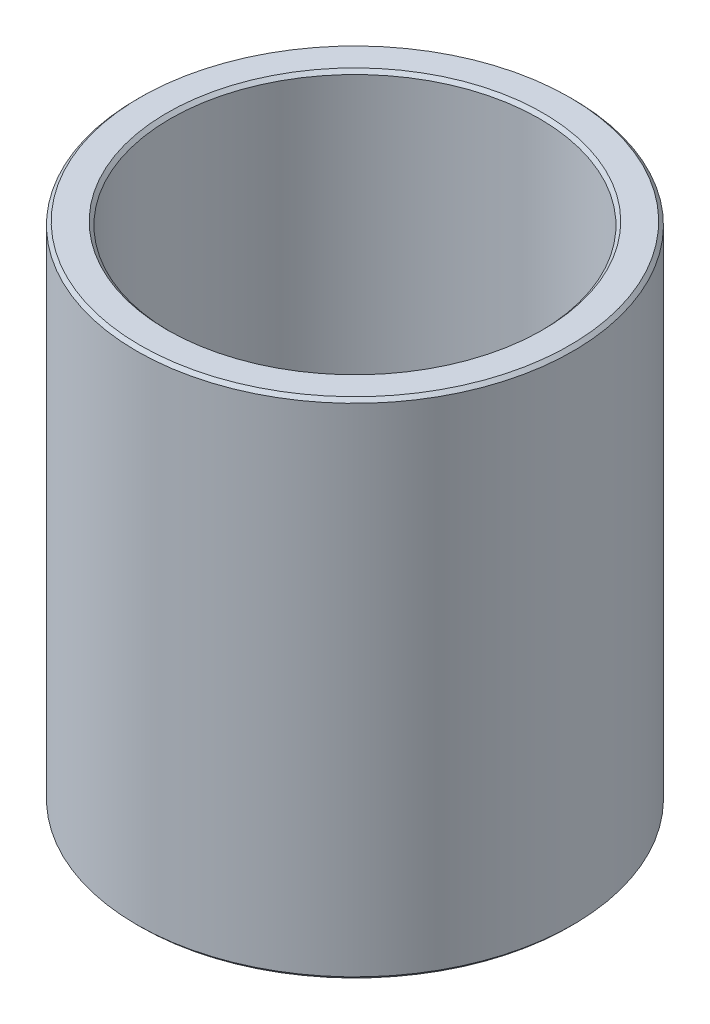
ISO-10303-21;
HEADER;
FILE_DESCRIPTION(('STEP AP214'),'2;1');
FILE_NAME('part.step','',(''),(''),'','','');
FILE_SCHEMA(('AUTOMOTIVE_DESIGN { 1 0 10303 214 1 1 1 1 }'));
ENDSEC;
DATA;
#1=APPLICATION_CONTEXT('core data for automotive mechanical design processes');
#2=APPLICATION_PROTOCOL_DEFINITION('international standard','automotive_design',2000,#1);
#3=PRODUCT_CONTEXT('',#1,'mechanical');
#4=PRODUCT('Part','Part','',(#3));
#5=PRODUCT_RELATED_PRODUCT_CATEGORY('part','',(#4));
#6=PRODUCT_DEFINITION_FORMATION('','',#4);
#7=PRODUCT_DEFINITION_CONTEXT('part definition',#1,'design');
#8=PRODUCT_DEFINITION('design','',#6,#7);
#9=PRODUCT_DEFINITION_SHAPE('','',#8);
#10=(LENGTH_UNIT() NAMED_UNIT(*) SI_UNIT(.MILLI.,.METRE.));
#11=(NAMED_UNIT(*) PLANE_ANGLE_UNIT() SI_UNIT($,.RADIAN.));
#12=(NAMED_UNIT(*) SI_UNIT($,.STERADIAN.) SOLID_ANGLE_UNIT());
#13=UNCERTAINTY_MEASURE_WITH_UNIT(LENGTH_MEASURE(1.E-05),#10,'distance_accuracy_value','');
#14=(GEOMETRIC_REPRESENTATION_CONTEXT(3) GLOBAL_UNCERTAINTY_ASSIGNED_CONTEXT((#13)) GLOBAL_UNIT_ASSIGNED_CONTEXT((#10,
#11,#12)) REPRESENTATION_CONTEXT('',''));
#15=CARTESIAN_POINT('',(0.,0.,0.));
#16=DIRECTION('',(0.,0.,1.));
#17=DIRECTION('',(1.,0.,0.));
#18=AXIS2_PLACEMENT_3D('',#15,#16,#17);
#19=CARTESIAN_POINT('',(0.,30.,0.));
#20=DIRECTION('',(0.,1.,0.));
#21=DIRECTION('',(0.,0.,1.));
#22=AXIS2_PLACEMENT_3D('',#19,#20,#21);
#23=PLANE('',#22);
#24=CARTESIAN_POINT('',(0.,30.,0.));
#25=DIRECTION('',(0.,1.,0.));
#26=DIRECTION('',(0.,0.,1.));
#27=AXIS2_PLACEMENT_3D('',#24,#25,#26);
#28=CIRCLE('',#27,11.2);
#29=CARTESIAN_POINT('',(0.,30.,11.2));
#30=VERTEX_POINT('',#29);
#31=EDGE_CURVE('E10',#30,#30,#28,.F.);
#32=ORIENTED_EDGE('',*,*,#31,.T.);
#33=EDGE_LOOP('',(#32));
#34=FACE_BOUND('',#33,.T.);
#35=CARTESIAN_POINT('',(0.,30.,0.));
#36=DIRECTION('',(0.,1.,0.));
#37=DIRECTION('',(0.,0.,1.));
#38=AXIS2_PLACEMENT_3D('',#35,#36,#37);
#39=CIRCLE('',#38,12.8);
#40=CARTESIAN_POINT('',(0.,30.,12.8));
#41=VERTEX_POINT('',#40);
#42=EDGE_CURVE('E37',#41,#41,#39,.T.);
#43=ORIENTED_EDGE('',*,*,#42,.T.);
#44=EDGE_LOOP('',(#43));
#45=FACE_BOUND('',#44,.T.);
#46=ADVANCED_FACE('F30',(#34,#45),#23,.T.);
#47=CARTESIAN_POINT('',(0.,0.,0.));
#48=DIRECTION('',(0.,1.,0.));
#49=DIRECTION('',(0.,0.,1.));
#50=AXIS2_PLACEMENT_3D('',#47,#48,#49);
#51=PLANE('',#50);
#52=CARTESIAN_POINT('',(0.,0.,0.));
#53=DIRECTION('',(0.,1.,0.));
#54=DIRECTION('',(0.,0.,1.));
#55=AXIS2_PLACEMENT_3D('',#52,#53,#54);
#56=CIRCLE('',#55,11.2);
#57=CARTESIAN_POINT('',(0.,0.,11.2));
#58=VERTEX_POINT('',#57);
#59=EDGE_CURVE('E56',#58,#58,#56,.T.);
#60=ORIENTED_EDGE('',*,*,#59,.T.);
#61=EDGE_LOOP('',(#60));
#62=FACE_BOUND('',#61,.T.);
#63=CARTESIAN_POINT('',(0.,0.,0.));
#64=DIRECTION('',(0.,1.,0.));
#65=DIRECTION('',(0.,0.,1.));
#66=AXIS2_PLACEMENT_3D('',#63,#64,#65);
#67=CIRCLE('',#66,12.8);
#68=CARTESIAN_POINT('',(0.,0.,12.8));
#69=VERTEX_POINT('',#68);
#70=EDGE_CURVE('E59',#69,#69,#67,.F.);
#71=ORIENTED_EDGE('',*,*,#70,.T.);
#72=EDGE_LOOP('',(#71));
#73=FACE_BOUND('',#72,.T.);
#74=ADVANCED_FACE('F63',(#62,#73),#51,.F.);
#75=CARTESIAN_POINT('',(0.,30.,0.));
#76=DIRECTION('',(0.,-1.,0.));
#77=DIRECTION('',(0.,0.,-1.));
#78=AXIS2_PLACEMENT_3D('',#75,#76,#77);
#79=CYLINDRICAL_SURFACE('',#78,13.);
#80=CARTESIAN_POINT('',(0.,0.200000000000006,0.));
#81=DIRECTION('',(0.,1.,0.));
#82=DIRECTION('',(0.,0.,1.));
#83=AXIS2_PLACEMENT_3D('',#80,#81,#82);
#84=CIRCLE('',#83,13.);
#85=CARTESIAN_POINT('',(0.,0.200000000000006,13.));
#86=VERTEX_POINT('',#85);
#87=EDGE_CURVE('E41',#86,#86,#84,.T.);
#88=ORIENTED_EDGE('',*,*,#87,.T.);
#89=EDGE_LOOP('',(#88));
#90=FACE_BOUND('',#89,.T.);
#91=CARTESIAN_POINT('',(0.,29.8,0.));
#92=DIRECTION('',(0.,1.,0.));
#93=DIRECTION('',(0.,0.,1.));
#94=AXIS2_PLACEMENT_3D('',#91,#92,#93);
#95=CIRCLE('',#94,13.);
#96=CARTESIAN_POINT('',(0.,29.8,13.));
#97=VERTEX_POINT('',#96);
#98=EDGE_CURVE('E45',#97,#97,#95,.F.);
#99=ORIENTED_EDGE('',*,*,#98,.T.);
#100=EDGE_LOOP('',(#99));
#101=FACE_BOUND('',#100,.T.);
#102=ADVANCED_FACE('F73',(#90,#101),#79,.T.);
#103=CARTESIAN_POINT('',(0.,30.,0.));
#104=DIRECTION('',(0.,-1.,0.));
#105=DIRECTION('',(0.,0.,-1.));
#106=AXIS2_PLACEMENT_3D('',#103,#104,#105);
#107=CYLINDRICAL_SURFACE('',#106,11.);
#108=CARTESIAN_POINT('',(0.,0.199999999999995,0.));
#109=DIRECTION('',(0.,1.,0.));
#110=DIRECTION('',(0.,0.,1.));
#111=AXIS2_PLACEMENT_3D('',#108,#109,#110);
#112=CIRCLE('',#111,11.);
#113=CARTESIAN_POINT('',(0.,0.199999999999995,11.));
#114=VERTEX_POINT('',#113);
#115=EDGE_CURVE('E50',#114,#114,#112,.F.);
#116=ORIENTED_EDGE('',*,*,#115,.T.);
#117=EDGE_LOOP('',(#116));
#118=FACE_BOUND('',#117,.T.);
#119=CARTESIAN_POINT('',(0.,29.8,0.));
#120=DIRECTION('',(0.,1.,0.));
#121=DIRECTION('',(0.,0.,1.));
#122=AXIS2_PLACEMENT_3D('',#119,#120,#121);
#123=CIRCLE('',#122,11.);
#124=CARTESIAN_POINT('',(0.,29.8,11.));
#125=VERTEX_POINT('',#124);
#126=EDGE_CURVE('E53',#125,#125,#123,.T.);
#127=ORIENTED_EDGE('',*,*,#126,.T.);
#128=EDGE_LOOP('',(#127));
#129=FACE_BOUND('',#128,.T.);
#130=ADVANCED_FACE('F76',(#118,#129),#107,.F.);
#131=CARTESIAN_POINT('',(0.,0.,0.));
#132=DIRECTION('',(0.,-1.,0.));
#133=DIRECTION('',(0.,0.,-1.));
#134=AXIS2_PLACEMENT_3D('',#131,#132,#133);
#135=CONICAL_SURFACE('',#134,11.2,0.785398163397431);
#136=ORIENTED_EDGE('',*,*,#115,.F.);
#137=EDGE_LOOP('',(#136));
#138=FACE_BOUND('',#137,.T.);
#139=ORIENTED_EDGE('',*,*,#59,.F.);
#140=EDGE_LOOP('',(#139));
#141=FACE_BOUND('',#140,.T.);
#142=ADVANCED_FACE('F69',(#138,#141),#135,.F.);
#143=CARTESIAN_POINT('',(0.,0.200000000000006,0.));
#144=DIRECTION('',(0.,1.,0.));
#145=DIRECTION('',(0.,0.,1.));
#146=AXIS2_PLACEMENT_3D('',#143,#144,#145);
#147=CONICAL_SURFACE('',#146,13.,0.785398163397448);
#148=ORIENTED_EDGE('',*,*,#70,.F.);
#149=EDGE_LOOP('',(#148));
#150=FACE_BOUND('',#149,.T.);
#151=ORIENTED_EDGE('',*,*,#87,.F.);
#152=EDGE_LOOP('',(#151));
#153=FACE_BOUND('',#152,.T.);
#154=ADVANCED_FACE('F65',(#150,#153),#147,.T.);
#155=CARTESIAN_POINT('',(0.,29.8,0.));
#156=DIRECTION('',(0.,1.,0.));
#157=DIRECTION('',(0.,0.,1.));
#158=AXIS2_PLACEMENT_3D('',#155,#156,#157);
#159=CONICAL_SURFACE('',#158,11.,0.785398163397457);
#160=ORIENTED_EDGE('',*,*,#31,.F.);
#161=EDGE_LOOP('',(#160));
#162=FACE_BOUND('',#161,.T.);
#163=ORIENTED_EDGE('',*,*,#126,.F.);
#164=EDGE_LOOP('',(#163));
#165=FACE_BOUND('',#164,.T.);
#166=ADVANCED_FACE('F68',(#162,#165),#159,.F.);
#167=CARTESIAN_POINT('',(0.,30.,0.));
#168=DIRECTION('',(0.,-1.,0.));
#169=DIRECTION('',(0.,0.,-1.));
#170=AXIS2_PLACEMENT_3D('',#167,#168,#169);
#171=CONICAL_SURFACE('',#170,12.8,0.78539816339744);
#172=ORIENTED_EDGE('',*,*,#98,.F.);
#173=EDGE_LOOP('',(#172));
#174=FACE_BOUND('',#173,.T.);
#175=ORIENTED_EDGE('',*,*,#42,.F.);
#176=EDGE_LOOP('',(#175));
#177=FACE_BOUND('',#176,.T.);
#178=ADVANCED_FACE('F32',(#174,#177),#171,.T.);
#179=CLOSED_SHELL('',(#46,#74,#102,#130,#142,#154,#166,#178));
#180=MANIFOLD_SOLID_BREP('B2',#179);
#181=ADVANCED_BREP_SHAPE_REPRESENTATION('',(#18,#180),#14);
#182=SHAPE_DEFINITION_REPRESENTATION(#9,#181);
ENDSEC;
END-ISO-10303-21;
